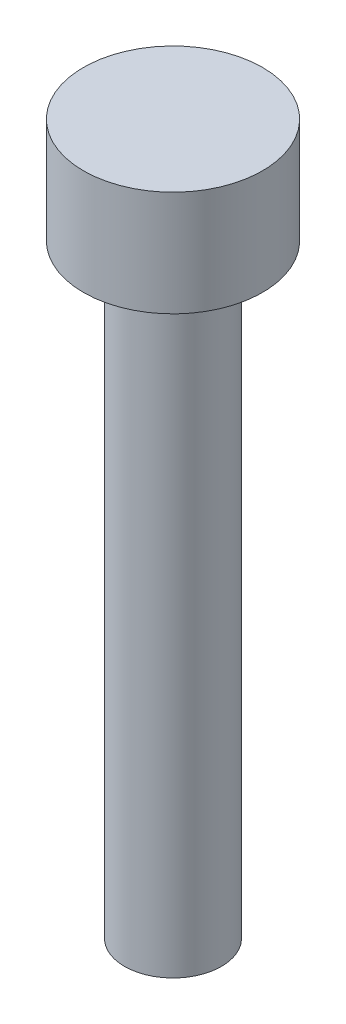
ISO-10303-21;
HEADER;
FILE_DESCRIPTION(('STEP AP214'),'2;1');
FILE_NAME('part.step','',(''),(''),'','','');
FILE_SCHEMA(('AUTOMOTIVE_DESIGN { 1 0 10303 214 1 1 1 1 }'));
ENDSEC;
DATA;
#1=APPLICATION_CONTEXT('core data for automotive mechanical design processes');
#2=APPLICATION_PROTOCOL_DEFINITION('international standard','automotive_design',2000,#1);
#3=PRODUCT_CONTEXT('',#1,'mechanical');
#4=PRODUCT('Part','Part','',(#3));
#5=PRODUCT_RELATED_PRODUCT_CATEGORY('part','',(#4));
#6=PRODUCT_DEFINITION_FORMATION('','',#4);
#7=PRODUCT_DEFINITION_CONTEXT('part definition',#1,'design');
#8=PRODUCT_DEFINITION('design','',#6,#7);
#9=PRODUCT_DEFINITION_SHAPE('','',#8);
#10=(LENGTH_UNIT() NAMED_UNIT(*) SI_UNIT(.MILLI.,.METRE.));
#11=(NAMED_UNIT(*) PLANE_ANGLE_UNIT() SI_UNIT($,.RADIAN.));
#12=(NAMED_UNIT(*) SI_UNIT($,.STERADIAN.) SOLID_ANGLE_UNIT());
#13=UNCERTAINTY_MEASURE_WITH_UNIT(LENGTH_MEASURE(1.E-05),#10,'distance_accuracy_value','');
#14=(GEOMETRIC_REPRESENTATION_CONTEXT(3) GLOBAL_UNCERTAINTY_ASSIGNED_CONTEXT((#13)) GLOBAL_UNIT_ASSIGNED_CONTEXT((#10,
#11,#12)) REPRESENTATION_CONTEXT('',''));
#15=CARTESIAN_POINT('',(0.,0.,0.));
#16=DIRECTION('',(0.,0.,1.));
#17=DIRECTION('',(1.,0.,0.));
#18=AXIS2_PLACEMENT_3D('',#15,#16,#17);
#19=CARTESIAN_POINT('',(0.,35.,4.25));
#20=DIRECTION('',(0.,1.,0.));
#21=DIRECTION('',(0.,0.,1.));
#22=AXIS2_PLACEMENT_3D('',#19,#20,#21);
#23=PLANE('',#22);
#24=CARTESIAN_POINT('',(0.,35.,0.));
#25=DIRECTION('',(0.,1.,0.));
#26=DIRECTION('',(0.,0.,1.));
#27=AXIS2_PLACEMENT_3D('',#24,#25,#26);
#28=CIRCLE('',#27,4.25);
#29=CARTESIAN_POINT('',(0.,35.,4.25));
#30=VERTEX_POINT('',#29);
#31=EDGE_CURVE('E20',#30,#30,#28,.F.);
#32=ORIENTED_EDGE('',*,*,#31,.F.);
#33=EDGE_LOOP('',(#32));
#34=FACE_BOUND('',#33,.T.);
#35=ADVANCED_FACE('F17',(#34),#23,.T.);
#36=CARTESIAN_POINT('',(0.,17.5,0.));
#37=DIRECTION('',(0.,1.,0.));
#38=DIRECTION('',(0.,0.,1.));
#39=AXIS2_PLACEMENT_3D('',#36,#37,#38);
#40=CYLINDRICAL_SURFACE('',#39,4.25);
#41=CARTESIAN_POINT('',(0.,30.,0.));
#42=DIRECTION('',(0.,1.,0.));
#43=DIRECTION('',(0.,0.,1.));
#44=AXIS2_PLACEMENT_3D('',#41,#42,#43);
#45=CIRCLE('',#44,4.25);
#46=CARTESIAN_POINT('',(0.,30.,4.25));
#47=VERTEX_POINT('',#46);
#48=EDGE_CURVE('E42',#47,#47,#45,.T.);
#49=ORIENTED_EDGE('',*,*,#48,.T.);
#50=EDGE_LOOP('',(#49));
#51=FACE_BOUND('',#50,.T.);
#52=ORIENTED_EDGE('',*,*,#31,.T.);
#53=EDGE_LOOP('',(#52));
#54=FACE_BOUND('',#53,.T.);
#55=ADVANCED_FACE('F50',(#51,#54),#40,.T.);
#56=CARTESIAN_POINT('',(0.,30.,2.3));
#57=DIRECTION('',(0.,1.,0.));
#58=DIRECTION('',(0.,0.,1.));
#59=AXIS2_PLACEMENT_3D('',#56,#57,#58);
#60=PLANE('',#59);
#61=CARTESIAN_POINT('',(0.,30.,0.));
#62=DIRECTION('',(0.,1.,0.));
#63=DIRECTION('',(0.,0.,1.));
#64=AXIS2_PLACEMENT_3D('',#61,#62,#63);
#65=CIRCLE('',#64,2.3);
#66=CARTESIAN_POINT('',(0.,30.,2.3));
#67=VERTEX_POINT('',#66);
#68=EDGE_CURVE('E24',#67,#67,#65,.F.);
#69=ORIENTED_EDGE('',*,*,#68,.F.);
#70=EDGE_LOOP('',(#69));
#71=FACE_BOUND('',#70,.T.);
#72=ORIENTED_EDGE('',*,*,#48,.F.);
#73=EDGE_LOOP('',(#72));
#74=FACE_BOUND('',#73,.T.);
#75=ADVANCED_FACE('F32',(#71,#74),#60,.F.);
#76=CARTESIAN_POINT('',(0.,1.32790561917773,0.));
#77=DIRECTION('',(0.,1.,0.));
#78=DIRECTION('',(0.,0.,1.));
#79=AXIS2_PLACEMENT_3D('',#76,#77,#78);
#80=CONICAL_SURFACE('',#79,2.30000000001697,1.04719755114377);
#81=CARTESIAN_POINT('',(0.,-5.6843418860808E-11,0.));
#82=VERTEX_POINT('',#81);
#83=VERTEX_LOOP('',#82);
#84=FACE_BOUND('',#83,.T.);
#85=CARTESIAN_POINT('',(0.,1.32790561952,0.));
#86=DIRECTION('',(0.,1.,0.));
#87=DIRECTION('',(0.,0.,1.));
#88=AXIS2_PLACEMENT_3D('',#85,#86,#87);
#89=CIRCLE('',#88,2.3);
#90=CARTESIAN_POINT('',(0.,1.32790561952,2.3));
#91=VERTEX_POINT('',#90);
#92=EDGE_CURVE('E11',#91,#91,#89,.T.);
#93=ORIENTED_EDGE('',*,*,#92,.F.);
#94=EDGE_LOOP('',(#93));
#95=FACE_BOUND('',#94,.T.);
#96=ADVANCED_FACE('F28',(#84,#95),#80,.T.);
#97=CARTESIAN_POINT('',(0.,17.5,0.));
#98=DIRECTION('',(0.,1.,0.));
#99=DIRECTION('',(0.,0.,1.));
#100=AXIS2_PLACEMENT_3D('',#97,#98,#99);
#101=CYLINDRICAL_SURFACE('',#100,2.3);
#102=ORIENTED_EDGE('',*,*,#92,.T.);
#103=EDGE_LOOP('',(#102));
#104=FACE_BOUND('',#103,.T.);
#105=ORIENTED_EDGE('',*,*,#68,.T.);
#106=EDGE_LOOP('',(#105));
#107=FACE_BOUND('',#106,.T.);
#108=ADVANCED_FACE('F31',(#104,#107),#101,.T.);
#109=CLOSED_SHELL('',(#35,#55,#75,#96,#108));
#110=MANIFOLD_SOLID_BREP('B1',#109);
#111=ADVANCED_BREP_SHAPE_REPRESENTATION('',(#18,#110),#14);
#112=SHAPE_DEFINITION_REPRESENTATION(#9,#111);
ENDSEC;
END-ISO-10303-21;
